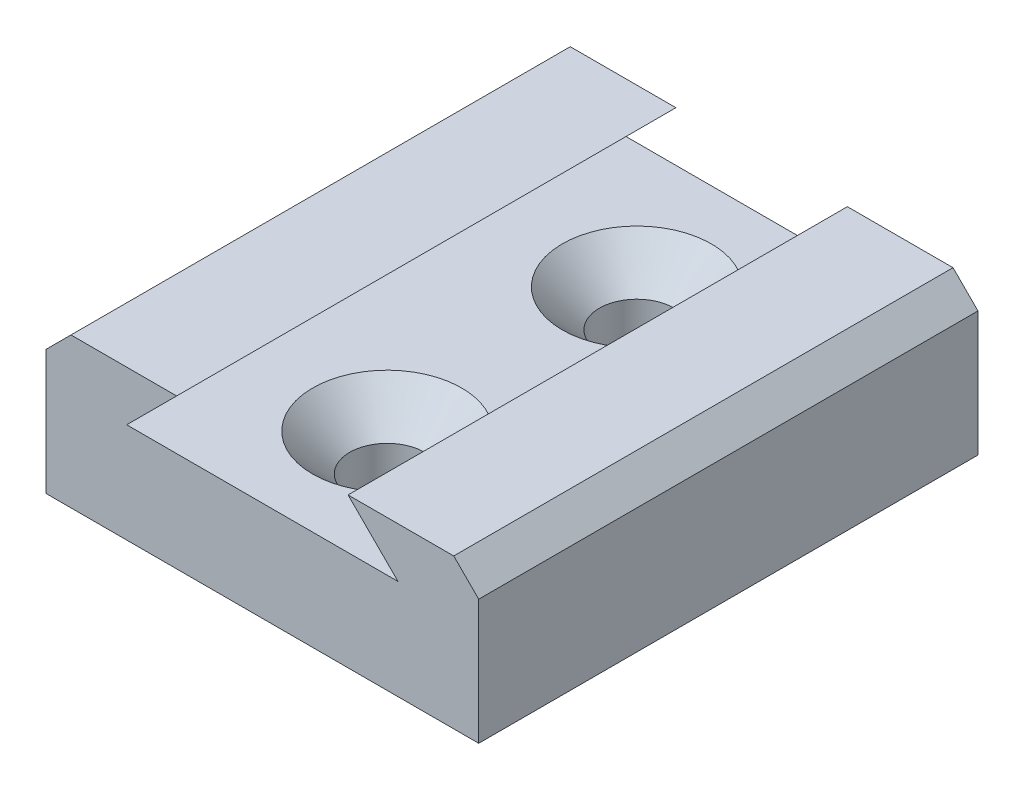
ISO-10303-21;
HEADER;
FILE_DESCRIPTION(('STEP AP214'),'2;1');
FILE_NAME('part.step','',(''),(''),'','','');
FILE_SCHEMA(('AUTOMOTIVE_DESIGN { 1 0 10303 214 1 1 1 1 }'));
ENDSEC;
DATA;
#1=APPLICATION_CONTEXT('core data for automotive mechanical design processes');
#2=APPLICATION_PROTOCOL_DEFINITION('international standard','automotive_design',2000,#1);
#3=PRODUCT_CONTEXT('',#1,'mechanical');
#4=PRODUCT('Part','Part','',(#3));
#5=PRODUCT_RELATED_PRODUCT_CATEGORY('part','',(#4));
#6=PRODUCT_DEFINITION_FORMATION('','',#4);
#7=PRODUCT_DEFINITION_CONTEXT('part definition',#1,'design');
#8=PRODUCT_DEFINITION('design','',#6,#7);
#9=PRODUCT_DEFINITION_SHAPE('','',#8);
#10=(LENGTH_UNIT() NAMED_UNIT(*) SI_UNIT(.MILLI.,.METRE.));
#11=(NAMED_UNIT(*) PLANE_ANGLE_UNIT() SI_UNIT($,.RADIAN.));
#12=(NAMED_UNIT(*) SI_UNIT($,.STERADIAN.) SOLID_ANGLE_UNIT());
#13=UNCERTAINTY_MEASURE_WITH_UNIT(LENGTH_MEASURE(1.E-05),#10,'distance_accuracy_value','');
#14=(GEOMETRIC_REPRESENTATION_CONTEXT(3) GLOBAL_UNCERTAINTY_ASSIGNED_CONTEXT((#13)) GLOBAL_UNIT_ASSIGNED_CONTEXT((#10,
#11,#12)) REPRESENTATION_CONTEXT('',''));
#15=CARTESIAN_POINT('',(0.,0.,0.));
#16=DIRECTION('',(0.,0.,1.));
#17=DIRECTION('',(1.,0.,0.));
#18=AXIS2_PLACEMENT_3D('',#15,#16,#17);
#19=CARTESIAN_POINT('',(8.15,6.,30.));
#20=DIRECTION('',(0.,-1.,0.));
#21=DIRECTION('',(0.,0.,-1.));
#22=AXIS2_PLACEMENT_3D('',#19,#20,#21);
#23=PLANE('',#22);
#24=CARTESIAN_POINT('',(0.,6.,22.5));
#25=DIRECTION('',(0.,1.,0.));
#26=DIRECTION('',(0.,0.,1.));
#27=AXIS2_PLACEMENT_3D('',#24,#25,#26);
#28=CIRCLE('',#27,4.48);
#29=CARTESIAN_POINT('',(0.,6.,26.98));
#30=VERTEX_POINT('',#29);
#31=EDGE_CURVE('E219',#30,#30,#28,.T.);
#32=ORIENTED_EDGE('',*,*,#31,.F.);
#33=EDGE_LOOP('',(#32));
#34=FACE_BOUND('',#33,.T.);
#35=DIRECTION('',(-1.,0.,0.));
#36=VECTOR('',#35,1.);
#37=CARTESIAN_POINT('',(8.15,6.,0.));
#38=LINE('',#37,#36);
#39=CARTESIAN_POINT('',(8.15,6.,0.));
#40=VERTEX_POINT('',#39);
#41=CARTESIAN_POINT('',(-8.15,6.,0.));
#42=VERTEX_POINT('',#41);
#43=EDGE_CURVE('E158',#40,#42,#38,.T.);
#44=ORIENTED_EDGE('',*,*,#43,.T.);
#45=DIRECTION('',(0.,0.,-1.));
#46=VECTOR('',#45,1.);
#47=CARTESIAN_POINT('',(-8.15,6.,30.));
#48=LINE('',#47,#46);
#49=CARTESIAN_POINT('',(-8.15,6.,30.));
#50=VERTEX_POINT('',#49);
#51=EDGE_CURVE('E174',#50,#42,#48,.T.);
#52=ORIENTED_EDGE('',*,*,#51,.F.);
#53=DIRECTION('',(-1.,0.,0.));
#54=VECTOR('',#53,1.);
#55=CARTESIAN_POINT('',(8.15,6.,30.));
#56=LINE('',#55,#54);
#57=CARTESIAN_POINT('',(8.15,6.,30.));
#58=VERTEX_POINT('',#57);
#59=EDGE_CURVE('E203',#58,#50,#56,.T.);
#60=ORIENTED_EDGE('',*,*,#59,.F.);
#61=DIRECTION('',(0.,0.,-1.));
#62=VECTOR('',#61,1.);
#63=CARTESIAN_POINT('',(8.15,6.,30.));
#64=LINE('',#63,#62);
#65=EDGE_CURVE('E177',#58,#40,#64,.T.);
#66=ORIENTED_EDGE('',*,*,#65,.T.);
#67=EDGE_LOOP('',(#44,#52,#60,#66));
#68=FACE_BOUND('',#67,.T.);
#69=CARTESIAN_POINT('',(0.,6.,7.5));
#70=DIRECTION('',(0.,1.,0.));
#71=DIRECTION('',(0.,0.,1.));
#72=AXIS2_PLACEMENT_3D('',#69,#70,#71);
#73=CIRCLE('',#72,4.48);
#74=CARTESIAN_POINT('',(0.,6.,11.98));
#75=VERTEX_POINT('',#74);
#76=EDGE_CURVE('E228',#75,#75,#73,.T.);
#77=ORIENTED_EDGE('',*,*,#76,.F.);
#78=EDGE_LOOP('',(#77));
#79=FACE_BOUND('',#78,.T.);
#80=ADVANCED_FACE('F39',(#34,#68,#79),#23,.F.);
#81=CARTESIAN_POINT('',(13.,0.,30.));
#82=DIRECTION('',(-1.,0.,0.));
#83=DIRECTION('',(0.,-1.,0.));
#84=AXIS2_PLACEMENT_3D('',#81,#82,#83);
#85=PLANE('',#84);
#86=DIRECTION('',(0.,1.,0.));
#87=VECTOR('',#86,1.);
#88=CARTESIAN_POINT('',(13.,0.,0.));
#89=LINE('',#88,#87);
#90=CARTESIAN_POINT('',(13.,0.,0.));
#91=VERTEX_POINT('',#90);
#92=CARTESIAN_POINT('',(13.,7.4999999999999,0.));
#93=VERTEX_POINT('',#92);
#94=EDGE_CURVE('E148',#91,#93,#89,.T.);
#95=ORIENTED_EDGE('',*,*,#94,.T.);
#96=DIRECTION('',(0.,0.,-1.));
#97=VECTOR('',#96,1.);
#98=CARTESIAN_POINT('',(13.,7.4999999999999,30.));
#99=LINE('',#98,#97);
#100=CARTESIAN_POINT('',(13.,7.4999999999999,30.));
#101=VERTEX_POINT('',#100);
#102=EDGE_CURVE('E11',#101,#93,#99,.T.);
#103=ORIENTED_EDGE('',*,*,#102,.F.);
#104=DIRECTION('',(0.,1.,0.));
#105=VECTOR('',#104,1.);
#106=CARTESIAN_POINT('',(13.,0.,30.));
#107=LINE('',#106,#105);
#108=CARTESIAN_POINT('',(13.,0.,30.));
#109=VERTEX_POINT('',#108);
#110=EDGE_CURVE('E167',#109,#101,#107,.T.);
#111=ORIENTED_EDGE('',*,*,#110,.F.);
#112=DIRECTION('',(0.,0.,-1.));
#113=VECTOR('',#112,1.);
#114=CARTESIAN_POINT('',(13.,0.,30.));
#115=LINE('',#114,#113);
#116=EDGE_CURVE('E144',#109,#91,#115,.T.);
#117=ORIENTED_EDGE('',*,*,#116,.T.);
#118=EDGE_LOOP('',(#95,#103,#111,#117));
#119=FACE_BOUND('',#118,.T.);
#120=ADVANCED_FACE('F41',(#119),#85,.F.);
#121=CARTESIAN_POINT('',(13.,7.4999999999999,30.));
#122=DIRECTION('',(-0.707106781186529,-0.707106781186565,0.));
#123=DIRECTION('',(0.707106781186566,-0.70710678118653,0.));
#124=AXIS2_PLACEMENT_3D('',#121,#122,#123);
#125=PLANE('',#124);
#126=DIRECTION('',(-0.707106781186565,0.707106781186529,0.));
#127=VECTOR('',#126,1.);
#128=CARTESIAN_POINT('',(13.,7.4999999999999,0.));
#129=LINE('',#128,#127);
#130=CARTESIAN_POINT('',(11.5,8.99999999999982,0.));
#131=VERTEX_POINT('',#130);
#132=EDGE_CURVE('E151',#93,#131,#129,.T.);
#133=ORIENTED_EDGE('',*,*,#132,.T.);
#134=DIRECTION('',(0.,0.,-1.));
#135=VECTOR('',#134,1.);
#136=CARTESIAN_POINT('',(11.5,8.99999999999982,30.));
#137=LINE('',#136,#135);
#138=CARTESIAN_POINT('',(11.5,8.99999999999982,30.));
#139=VERTEX_POINT('',#138);
#140=EDGE_CURVE('E48',#139,#131,#137,.T.);
#141=ORIENTED_EDGE('',*,*,#140,.F.);
#142=DIRECTION('',(-0.707106781186565,0.707106781186529,0.));
#143=VECTOR('',#142,1.);
#144=CARTESIAN_POINT('',(13.,7.4999999999999,30.));
#145=LINE('',#144,#143);
#146=EDGE_CURVE('E105',#101,#139,#145,.T.);
#147=ORIENTED_EDGE('',*,*,#146,.F.);
#148=ORIENTED_EDGE('',*,*,#102,.T.);
#149=EDGE_LOOP('',(#133,#141,#147,#148));
#150=FACE_BOUND('',#149,.T.);
#151=ADVANCED_FACE('F241',(#150),#125,.F.);
#152=CARTESIAN_POINT('',(11.5,8.99999999999982,30.));
#153=DIRECTION('',(0.,-1.,0.));
#154=DIRECTION('',(1.,0.,0.));
#155=AXIS2_PLACEMENT_3D('',#152,#153,#154);
#156=PLANE('',#155);
#157=DIRECTION('',(-1.,0.,0.));
#158=VECTOR('',#157,1.);
#159=CARTESIAN_POINT('',(11.5,8.99999999999982,0.));
#160=LINE('',#159,#158);
#161=CARTESIAN_POINT('',(5.15000000000002,8.99999999999982,0.));
#162=VERTEX_POINT('',#161);
#163=EDGE_CURVE('E154',#131,#162,#160,.T.);
#164=ORIENTED_EDGE('',*,*,#163,.T.);
#165=DIRECTION('',(0.,0.,-1.));
#166=VECTOR('',#165,1.);
#167=CARTESIAN_POINT('',(5.15000000000002,8.99999999999982,30.));
#168=LINE('',#167,#166);
#169=CARTESIAN_POINT('',(5.15000000000002,8.99999999999982,30.));
#170=VERTEX_POINT('',#169);
#171=EDGE_CURVE('E180',#170,#162,#168,.T.);
#172=ORIENTED_EDGE('',*,*,#171,.F.);
#173=DIRECTION('',(-1.,0.,0.));
#174=VECTOR('',#173,1.);
#175=CARTESIAN_POINT('',(11.5,8.99999999999982,30.));
#176=LINE('',#175,#174);
#177=EDGE_CURVE('E188',#139,#170,#176,.T.);
#178=ORIENTED_EDGE('',*,*,#177,.F.);
#179=ORIENTED_EDGE('',*,*,#140,.T.);
#180=EDGE_LOOP('',(#164,#172,#178,#179));
#181=FACE_BOUND('',#180,.T.);
#182=ADVANCED_FACE('F186',(#181),#156,.F.);
#183=CARTESIAN_POINT('',(5.15000000000002,8.99999999999982,30.));
#184=DIRECTION('',(0.70710678118653,0.707106781186565,0.));
#185=DIRECTION('',(-0.707106781186565,0.70710678118653,0.));
#186=AXIS2_PLACEMENT_3D('',#183,#184,#185);
#187=PLANE('',#186);
#188=DIRECTION('',(0.707106781186565,-0.70710678118653,0.));
#189=VECTOR('',#188,1.);
#190=CARTESIAN_POINT('',(5.15000000000002,8.99999999999982,0.));
#191=LINE('',#190,#189);
#192=EDGE_CURVE('E156',#162,#40,#191,.T.);
#193=ORIENTED_EDGE('',*,*,#192,.T.);
#194=ORIENTED_EDGE('',*,*,#65,.F.);
#195=DIRECTION('',(0.707106781186565,-0.70710678118653,0.));
#196=VECTOR('',#195,1.);
#197=CARTESIAN_POINT('',(5.15000000000002,8.99999999999982,30.));
#198=LINE('',#197,#196);
#199=EDGE_CURVE('E206',#170,#58,#198,.T.);
#200=ORIENTED_EDGE('',*,*,#199,.F.);
#201=ORIENTED_EDGE('',*,*,#171,.T.);
#202=EDGE_LOOP('',(#193,#194,#200,#201));
#203=FACE_BOUND('',#202,.T.);
#204=ADVANCED_FACE('F197',(#203),#187,.F.);
#205=CARTESIAN_POINT('',(-8.15,6.,30.));
#206=DIRECTION('',(-0.707106781186523,0.707106781186572,0.));
#207=DIRECTION('',(-0.707106781186572,-0.707106781186523,0.));
#208=AXIS2_PLACEMENT_3D('',#205,#206,#207);
#209=PLANE('',#208);
#210=DIRECTION('',(0.707106781186572,0.707106781186523,0.));
#211=VECTOR('',#210,1.);
#212=CARTESIAN_POINT('',(-8.15,6.,0.));
#213=LINE('',#212,#211);
#214=CARTESIAN_POINT('',(-5.14999999999997,8.99999999999982,0.));
#215=VERTEX_POINT('',#214);
#216=EDGE_CURVE('E160',#42,#215,#213,.T.);
#217=ORIENTED_EDGE('',*,*,#216,.T.);
#218=DIRECTION('',(0.,0.,-1.));
#219=VECTOR('',#218,1.);
#220=CARTESIAN_POINT('',(-5.14999999999997,8.99999999999982,30.));
#221=LINE('',#220,#219);
#222=CARTESIAN_POINT('',(-5.14999999999997,8.99999999999982,30.));
#223=VERTEX_POINT('',#222);
#224=EDGE_CURVE('E171',#223,#215,#221,.T.);
#225=ORIENTED_EDGE('',*,*,#224,.F.);
#226=DIRECTION('',(0.707106781186572,0.707106781186523,0.));
#227=VECTOR('',#226,1.);
#228=CARTESIAN_POINT('',(-8.15,6.,30.));
#229=LINE('',#228,#227);
#230=EDGE_CURVE('E205',#50,#223,#229,.T.);
#231=ORIENTED_EDGE('',*,*,#230,.F.);
#232=ORIENTED_EDGE('',*,*,#51,.T.);
#233=EDGE_LOOP('',(#217,#225,#231,#232));
#234=FACE_BOUND('',#233,.T.);
#235=ADVANCED_FACE('F246',(#234),#209,.F.);
#236=CARTESIAN_POINT('',(-5.14999999999997,8.99999999999982,30.));
#237=DIRECTION('',(0.,-1.,0.));
#238=DIRECTION('',(1.,0.,0.));
#239=AXIS2_PLACEMENT_3D('',#236,#237,#238);
#240=PLANE('',#239);
#241=DIRECTION('',(-1.,0.,0.));
#242=VECTOR('',#241,1.);
#243=CARTESIAN_POINT('',(-5.14999999999997,8.99999999999982,0.));
#244=LINE('',#243,#242);
#245=CARTESIAN_POINT('',(-11.5,8.99999999999982,0.));
#246=VERTEX_POINT('',#245);
#247=EDGE_CURVE('E162',#215,#246,#244,.T.);
#248=ORIENTED_EDGE('',*,*,#247,.T.);
#249=DIRECTION('',(0.,0.,-1.));
#250=VECTOR('',#249,1.);
#251=CARTESIAN_POINT('',(-11.5,8.99999999999982,30.));
#252=LINE('',#251,#250);
#253=CARTESIAN_POINT('',(-11.5,8.99999999999982,30.));
#254=VERTEX_POINT('',#253);
#255=EDGE_CURVE('E139',#254,#246,#252,.T.);
#256=ORIENTED_EDGE('',*,*,#255,.F.);
#257=DIRECTION('',(-1.,0.,0.));
#258=VECTOR('',#257,1.);
#259=CARTESIAN_POINT('',(-5.14999999999997,8.99999999999982,30.));
#260=LINE('',#259,#258);
#261=EDGE_CURVE('E130',#223,#254,#260,.T.);
#262=ORIENTED_EDGE('',*,*,#261,.F.);
#263=ORIENTED_EDGE('',*,*,#224,.T.);
#264=EDGE_LOOP('',(#248,#256,#262,#263));
#265=FACE_BOUND('',#264,.T.);
#266=ADVANCED_FACE('F258',(#265),#240,.F.);
#267=CARTESIAN_POINT('',(-11.5,8.99999999999982,30.));
#268=DIRECTION('',(0.707106781186522,-0.707106781186572,0.));
#269=DIRECTION('',(0.707106781186573,0.707106781186523,0.));
#270=AXIS2_PLACEMENT_3D('',#267,#268,#269);
#271=PLANE('',#270);
#272=DIRECTION('',(-0.707106781186573,-0.707106781186523,0.));
#273=VECTOR('',#272,1.);
#274=CARTESIAN_POINT('',(-11.5,8.99999999999982,0.));
#275=LINE('',#274,#273);
#276=CARTESIAN_POINT('',(-13.,7.49999999999992,0.));
#277=VERTEX_POINT('',#276);
#278=EDGE_CURVE('E138',#246,#277,#275,.T.);
#279=ORIENTED_EDGE('',*,*,#278,.T.);
#280=DIRECTION('',(0.,0.,-1.));
#281=VECTOR('',#280,1.);
#282=CARTESIAN_POINT('',(-13.,7.49999999999992,30.));
#283=LINE('',#282,#281);
#284=CARTESIAN_POINT('',(-13.,7.49999999999992,30.));
#285=VERTEX_POINT('',#284);
#286=EDGE_CURVE('E135',#285,#277,#283,.T.);
#287=ORIENTED_EDGE('',*,*,#286,.F.);
#288=DIRECTION('',(-0.707106781186573,-0.707106781186523,0.));
#289=VECTOR('',#288,1.);
#290=CARTESIAN_POINT('',(-11.5,8.99999999999982,30.));
#291=LINE('',#290,#289);
#292=EDGE_CURVE('E124',#254,#285,#291,.T.);
#293=ORIENTED_EDGE('',*,*,#292,.F.);
#294=ORIENTED_EDGE('',*,*,#255,.T.);
#295=EDGE_LOOP('',(#279,#287,#293,#294));
#296=FACE_BOUND('',#295,.T.);
#297=ADVANCED_FACE('F136',(#296),#271,.F.);
#298=CARTESIAN_POINT('',(-13.,7.49999999999992,30.));
#299=DIRECTION('',(1.,0.,0.));
#300=DIRECTION('',(0.,1.,0.));
#301=AXIS2_PLACEMENT_3D('',#298,#299,#300);
#302=PLANE('',#301);
#303=DIRECTION('',(0.,-1.,0.));
#304=VECTOR('',#303,1.);
#305=CARTESIAN_POINT('',(-13.,7.49999999999992,0.));
#306=LINE('',#305,#304);
#307=CARTESIAN_POINT('',(-13.,0.,0.));
#308=VERTEX_POINT('',#307);
#309=EDGE_CURVE('E91',#277,#308,#306,.T.);
#310=ORIENTED_EDGE('',*,*,#309,.T.);
#311=DIRECTION('',(0.,0.,-1.));
#312=VECTOR('',#311,1.);
#313=CARTESIAN_POINT('',(-13.,0.,30.));
#314=LINE('',#313,#312);
#315=CARTESIAN_POINT('',(-13.,0.,30.));
#316=VERTEX_POINT('',#315);
#317=EDGE_CURVE('E140',#316,#308,#314,.T.);
#318=ORIENTED_EDGE('',*,*,#317,.F.);
#319=DIRECTION('',(0.,-1.,0.));
#320=VECTOR('',#319,1.);
#321=CARTESIAN_POINT('',(-13.,7.49999999999992,30.));
#322=LINE('',#321,#320);
#323=EDGE_CURVE('E128',#285,#316,#322,.T.);
#324=ORIENTED_EDGE('',*,*,#323,.F.);
#325=ORIENTED_EDGE('',*,*,#286,.T.);
#326=EDGE_LOOP('',(#310,#318,#324,#325));
#327=FACE_BOUND('',#326,.T.);
#328=ADVANCED_FACE('F142',(#327),#302,.F.);
#329=CARTESIAN_POINT('',(-13.,0.,30.));
#330=DIRECTION('',(0.,1.,0.));
#331=DIRECTION('',(0.,0.,1.));
#332=AXIS2_PLACEMENT_3D('',#329,#330,#331);
#333=PLANE('',#332);
#334=CARTESIAN_POINT('',(0.,0.,7.5));
#335=DIRECTION('',(0.,1.,0.));
#336=DIRECTION('',(0.,0.,1.));
#337=AXIS2_PLACEMENT_3D('',#334,#335,#336);
#338=CIRCLE('',#337,2.25);
#339=CARTESIAN_POINT('',(0.,0.,9.75));
#340=VERTEX_POINT('',#339);
#341=EDGE_CURVE('E222',#340,#340,#338,.T.);
#342=ORIENTED_EDGE('',*,*,#341,.T.);
#343=EDGE_LOOP('',(#342));
#344=FACE_BOUND('',#343,.T.);
#345=CARTESIAN_POINT('',(0.,0.,22.5));
#346=DIRECTION('',(0.,1.,0.));
#347=DIRECTION('',(0.,0.,1.));
#348=AXIS2_PLACEMENT_3D('',#345,#346,#347);
#349=CIRCLE('',#348,2.25);
#350=CARTESIAN_POINT('',(0.,0.,24.75));
#351=VERTEX_POINT('',#350);
#352=EDGE_CURVE('E152',#351,#351,#349,.T.);
#353=ORIENTED_EDGE('',*,*,#352,.T.);
#354=EDGE_LOOP('',(#353));
#355=FACE_BOUND('',#354,.T.);
#356=DIRECTION('',(1.,0.,0.));
#357=VECTOR('',#356,1.);
#358=CARTESIAN_POINT('',(-13.,0.,0.));
#359=LINE('',#358,#357);
#360=EDGE_CURVE('E97',#308,#91,#359,.T.);
#361=ORIENTED_EDGE('',*,*,#360,.T.);
#362=ORIENTED_EDGE('',*,*,#116,.F.);
#363=DIRECTION('',(1.,0.,0.));
#364=VECTOR('',#363,1.);
#365=CARTESIAN_POINT('',(-13.,0.,30.));
#366=LINE('',#365,#364);
#367=EDGE_CURVE('E56',#316,#109,#366,.T.);
#368=ORIENTED_EDGE('',*,*,#367,.F.);
#369=ORIENTED_EDGE('',*,*,#317,.T.);
#370=EDGE_LOOP('',(#361,#362,#368,#369));
#371=FACE_BOUND('',#370,.T.);
#372=ADVANCED_FACE('F272',(#344,#355,#371),#333,.F.);
#373=CARTESIAN_POINT('',(0.,0.,30.));
#374=DIRECTION('',(0.,0.,1.));
#375=DIRECTION('',(1.,0.,0.));
#376=AXIS2_PLACEMENT_3D('',#373,#374,#375);
#377=PLANE('',#376);
#378=ORIENTED_EDGE('',*,*,#110,.T.);
#379=ORIENTED_EDGE('',*,*,#146,.T.);
#380=ORIENTED_EDGE('',*,*,#177,.T.);
#381=ORIENTED_EDGE('',*,*,#199,.T.);
#382=ORIENTED_EDGE('',*,*,#59,.T.);
#383=ORIENTED_EDGE('',*,*,#230,.T.);
#384=ORIENTED_EDGE('',*,*,#261,.T.);
#385=ORIENTED_EDGE('',*,*,#292,.T.);
#386=ORIENTED_EDGE('',*,*,#323,.T.);
#387=ORIENTED_EDGE('',*,*,#367,.T.);
#388=EDGE_LOOP('',(#378,#379,#380,#381,#382,#383,#384,#385,#386,#387));
#389=FACE_BOUND('',#388,.T.);
#390=ADVANCED_FACE('F126',(#389),#377,.T.);
#391=CARTESIAN_POINT('',(0.,0.,0.));
#392=DIRECTION('',(0.,0.,1.));
#393=DIRECTION('',(1.,0.,0.));
#394=AXIS2_PLACEMENT_3D('',#391,#392,#393);
#395=PLANE('',#394);
#396=ORIENTED_EDGE('',*,*,#94,.F.);
#397=ORIENTED_EDGE('',*,*,#360,.F.);
#398=ORIENTED_EDGE('',*,*,#309,.F.);
#399=ORIENTED_EDGE('',*,*,#278,.F.);
#400=ORIENTED_EDGE('',*,*,#247,.F.);
#401=ORIENTED_EDGE('',*,*,#216,.F.);
#402=ORIENTED_EDGE('',*,*,#43,.F.);
#403=ORIENTED_EDGE('',*,*,#192,.F.);
#404=ORIENTED_EDGE('',*,*,#163,.F.);
#405=ORIENTED_EDGE('',*,*,#132,.F.);
#406=EDGE_LOOP('',(#396,#397,#398,#399,#400,#401,#402,#403,#404,#405));
#407=FACE_BOUND('',#406,.T.);
#408=ADVANCED_FACE('F192',(#407),#395,.F.);
#409=CARTESIAN_POINT('',(0.,6.,22.5));
#410=DIRECTION('',(0.,1.,0.));
#411=DIRECTION('',(0.,0.,1.));
#412=AXIS2_PLACEMENT_3D('',#409,#410,#411);
#413=CYLINDRICAL_SURFACE('',#412,2.25);
#414=ORIENTED_EDGE('',*,*,#352,.F.);
#415=EDGE_LOOP('',(#414));
#416=FACE_BOUND('',#415,.T.);
#417=CARTESIAN_POINT('',(0.,3.77,22.5));
#418=DIRECTION('',(0.,1.,0.));
#419=DIRECTION('',(0.,0.,1.));
#420=AXIS2_PLACEMENT_3D('',#417,#418,#419);
#421=CIRCLE('',#420,2.25);
#422=CARTESIAN_POINT('',(0.,3.77,24.75));
#423=VERTEX_POINT('',#422);
#424=EDGE_CURVE('E216',#423,#423,#421,.T.);
#425=ORIENTED_EDGE('',*,*,#424,.T.);
#426=EDGE_LOOP('',(#425));
#427=FACE_BOUND('',#426,.T.);
#428=ADVANCED_FACE('F276',(#416,#427),#413,.F.);
#429=CARTESIAN_POINT('',(0.,6.,22.5));
#430=DIRECTION('',(0.,1.,0.));
#431=DIRECTION('',(0.,0.,1.));
#432=AXIS2_PLACEMENT_3D('',#429,#430,#431);
#433=CONICAL_SURFACE('',#432,4.48,0.785398163397449);
#434=ORIENTED_EDGE('',*,*,#424,.F.);
#435=EDGE_LOOP('',(#434));
#436=FACE_BOUND('',#435,.T.);
#437=ORIENTED_EDGE('',*,*,#31,.T.);
#438=EDGE_LOOP('',(#437));
#439=FACE_BOUND('',#438,.T.);
#440=ADVANCED_FACE('F281',(#436,#439),#433,.F.);
#441=CARTESIAN_POINT('',(0.,6.,7.5));
#442=DIRECTION('',(0.,1.,0.));
#443=DIRECTION('',(0.,0.,1.));
#444=AXIS2_PLACEMENT_3D('',#441,#442,#443);
#445=CYLINDRICAL_SURFACE('',#444,2.25);
#446=ORIENTED_EDGE('',*,*,#341,.F.);
#447=EDGE_LOOP('',(#446));
#448=FACE_BOUND('',#447,.T.);
#449=CARTESIAN_POINT('',(0.,3.77,7.5));
#450=DIRECTION('',(0.,1.,0.));
#451=DIRECTION('',(0.,0.,1.));
#452=AXIS2_PLACEMENT_3D('',#449,#450,#451);
#453=CIRCLE('',#452,2.25);
#454=CARTESIAN_POINT('',(0.,3.77,9.75));
#455=VERTEX_POINT('',#454);
#456=EDGE_CURVE('E225',#455,#455,#453,.T.);
#457=ORIENTED_EDGE('',*,*,#456,.T.);
#458=EDGE_LOOP('',(#457));
#459=FACE_BOUND('',#458,.T.);
#460=ADVANCED_FACE('F285',(#448,#459),#445,.F.);
#461=CARTESIAN_POINT('',(0.,6.,7.5));
#462=DIRECTION('',(0.,1.,0.));
#463=DIRECTION('',(0.,0.,1.));
#464=AXIS2_PLACEMENT_3D('',#461,#462,#463);
#465=CONICAL_SURFACE('',#464,4.48,0.785398163397449);
#466=ORIENTED_EDGE('',*,*,#456,.F.);
#467=EDGE_LOOP('',(#466));
#468=FACE_BOUND('',#467,.T.);
#469=ORIENTED_EDGE('',*,*,#76,.T.);
#470=EDGE_LOOP('',(#469));
#471=FACE_BOUND('',#470,.T.);
#472=ADVANCED_FACE('F232',(#468,#471),#465,.F.);
#473=CLOSED_SHELL('',(#80,#120,#151,#182,#204,#235,#266,#297,#328,#372,#390,#408,#428,#440,#460,#472));
#474=MANIFOLD_SOLID_BREP('B2',#473);
#475=ADVANCED_BREP_SHAPE_REPRESENTATION('',(#18,#474),#14);
#476=SHAPE_DEFINITION_REPRESENTATION(#9,#475);
ENDSEC;
END-ISO-10303-21;
